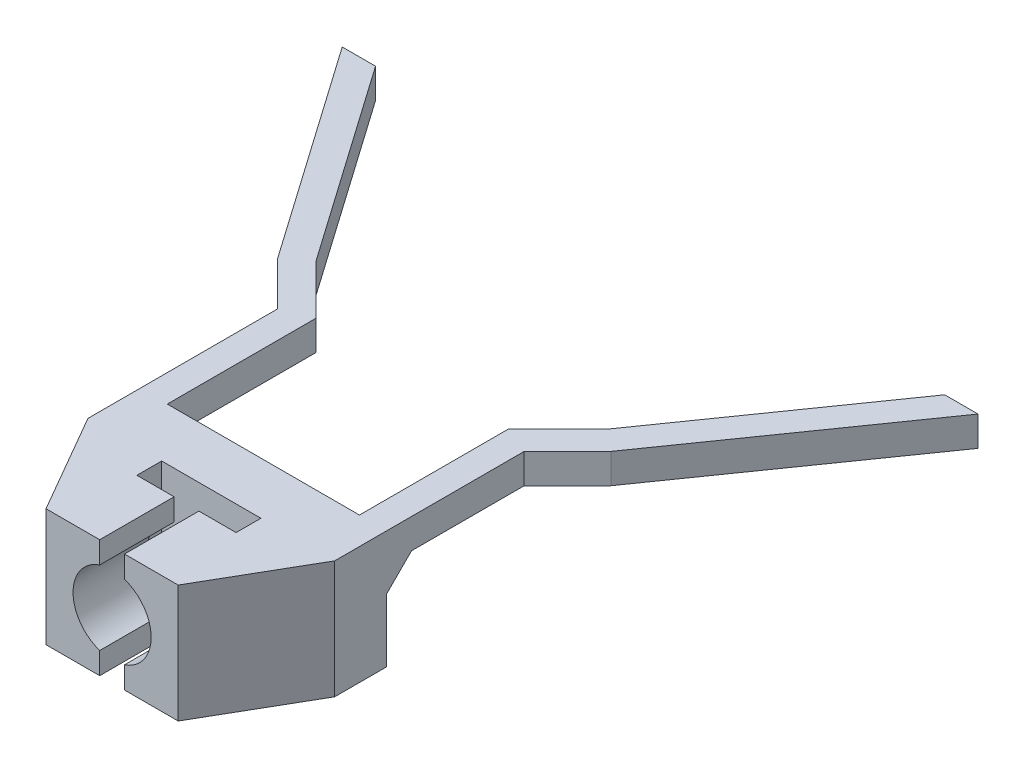
ISO-10303-21;
HEADER;
FILE_DESCRIPTION(('STEP AP214'),'2;1');
FILE_NAME('part.step','',(''),(''),'','','');
FILE_SCHEMA(('AUTOMOTIVE_DESIGN { 1 0 10303 214 1 1 1 1 }'));
ENDSEC;
DATA;
#1=APPLICATION_CONTEXT('core data for automotive mechanical design processes');
#2=APPLICATION_PROTOCOL_DEFINITION('international standard','automotive_design',2000,#1);
#3=PRODUCT_CONTEXT('',#1,'mechanical');
#4=PRODUCT('Part','Part','',(#3));
#5=PRODUCT_RELATED_PRODUCT_CATEGORY('part','',(#4));
#6=PRODUCT_DEFINITION_FORMATION('','',#4);
#7=PRODUCT_DEFINITION_CONTEXT('part definition',#1,'design');
#8=PRODUCT_DEFINITION('design','',#6,#7);
#9=PRODUCT_DEFINITION_SHAPE('','',#8);
#10=(LENGTH_UNIT() NAMED_UNIT(*) SI_UNIT(.MILLI.,.METRE.));
#11=(NAMED_UNIT(*) PLANE_ANGLE_UNIT() SI_UNIT($,.RADIAN.));
#12=(NAMED_UNIT(*) SI_UNIT($,.STERADIAN.) SOLID_ANGLE_UNIT());
#13=UNCERTAINTY_MEASURE_WITH_UNIT(LENGTH_MEASURE(1.E-05),#10,'distance_accuracy_value','');
#14=(GEOMETRIC_REPRESENTATION_CONTEXT(3) GLOBAL_UNCERTAINTY_ASSIGNED_CONTEXT((#13)) GLOBAL_UNIT_ASSIGNED_CONTEXT((#10,
#11,#12)) REPRESENTATION_CONTEXT('',''));
#15=CARTESIAN_POINT('',(0.,0.,0.));
#16=DIRECTION('',(0.,0.,1.));
#17=DIRECTION('',(1.,0.,0.));
#18=AXIS2_PLACEMENT_3D('',#15,#16,#17);
#19=CARTESIAN_POINT('',(0.,0.,12.2));
#20=DIRECTION('',(0.,0.,1.));
#21=DIRECTION('',(1.,0.,0.));
#22=AXIS2_PLACEMENT_3D('',#19,#20,#21);
#23=PLANE('',#22);
#24=DIRECTION('',(1.,0.,0.));
#25=VECTOR('',#24,1.);
#26=CARTESIAN_POINT('',(-9.95,-8.3,12.2));
#27=LINE('',#26,#25);
#28=CARTESIAN_POINT('',(1.,-8.3,12.2));
#29=VERTEX_POINT('',#28);
#30=CARTESIAN_POINT('',(5.33119784648299,-8.3,12.2));
#31=VERTEX_POINT('',#30);
#32=EDGE_CURVE('E366',#29,#31,#27,.T.);
#33=ORIENTED_EDGE('',*,*,#32,.T.);
#34=DIRECTION('',(0.,1.,0.));
#35=VECTOR('',#34,1.);
#36=CARTESIAN_POINT('',(5.33119784648299,0.,12.2));
#37=LINE('',#36,#35);
#38=CARTESIAN_POINT('',(5.33119784648299,1.2,12.2));
#39=VERTEX_POINT('',#38);
#40=EDGE_CURVE('E507',#31,#39,#37,.T.);
#41=ORIENTED_EDGE('',*,*,#40,.T.);
#42=DIRECTION('',(-1.,0.,0.));
#43=VECTOR('',#42,1.);
#44=CARTESIAN_POINT('',(-9.95,1.2,12.2));
#45=LINE('',#44,#43);
#46=CARTESIAN_POINT('',(1.,1.2,12.2));
#47=VERTEX_POINT('',#46);
#48=EDGE_CURVE('E370',#39,#47,#45,.T.);
#49=ORIENTED_EDGE('',*,*,#48,.T.);
#50=DIRECTION('',(0.,1.,0.));
#51=VECTOR('',#50,1.);
#52=CARTESIAN_POINT('',(1.,1.2,12.2));
#53=LINE('',#52,#51);
#54=CARTESIAN_POINT('',(1.,-0.562944593751231,12.2));
#55=VERTEX_POINT('',#54);
#56=EDGE_CURVE('E336',#55,#47,#53,.T.);
#57=ORIENTED_EDGE('',*,*,#56,.F.);
#58=CARTESIAN_POINT('',(0.,-3.55,12.2));
#59=DIRECTION('',(0.,0.,1.));
#60=DIRECTION('',(1.,0.,0.));
#61=AXIS2_PLACEMENT_3D('',#58,#59,#60);
#62=CIRCLE('',#61,3.15);
#63=CARTESIAN_POINT('',(0.999999999999999,-6.53705540624877,12.2));
#64=VERTEX_POINT('',#63);
#65=EDGE_CURVE('E333',#64,#55,#62,.T.);
#66=ORIENTED_EDGE('',*,*,#65,.F.);
#67=DIRECTION('',(0.,1.,0.));
#68=VECTOR('',#67,1.);
#69=CARTESIAN_POINT('',(1.,-6.53705540624877,12.2));
#70=LINE('',#69,#68);
#71=EDGE_CURVE('E330',#29,#64,#70,.T.);
#72=ORIENTED_EDGE('',*,*,#71,.F.);
#73=EDGE_LOOP('',(#33,#41,#49,#57,#66,#72));
#74=FACE_BOUND('',#73,.T.);
#75=ADVANCED_FACE('F39',(#74),#23,.T.);
#76=CARTESIAN_POINT('',(0.,-1.2,0.));
#77=DIRECTION('',(0.,1.,0.));
#78=DIRECTION('',(0.,0.,1.));
#79=AXIS2_PLACEMENT_3D('',#76,#77,#78);
#80=PLANE('',#79);
#81=DIRECTION('',(0.,0.,-1.));
#82=VECTOR('',#81,1.);
#83=CARTESIAN_POINT('',(-7.75,-1.2,0.));
#84=LINE('',#83,#82);
#85=CARTESIAN_POINT('',(-7.75,-1.2,-1.99999999999999));
#86=VERTEX_POINT('',#85);
#87=CARTESIAN_POINT('',(-7.75,-1.2,-12.));
#88=VERTEX_POINT('',#87);
#89=EDGE_CURVE('E432',#86,#88,#84,.T.);
#90=ORIENTED_EDGE('',*,*,#89,.F.);
#91=DIRECTION('',(-1.,0.,0.));
#92=VECTOR('',#91,1.);
#93=CARTESIAN_POINT('',(-9.95,-1.2,-1.99999999999999));
#94=LINE('',#93,#92);
#95=CARTESIAN_POINT('',(-9.95,-1.2,-2.));
#96=VERTEX_POINT('',#95);
#97=EDGE_CURVE('E496',#86,#96,#94,.T.);
#98=ORIENTED_EDGE('',*,*,#97,.T.);
#99=DIRECTION('',(0.,0.,1.));
#100=VECTOR('',#99,1.);
#101=CARTESIAN_POINT('',(-9.95,-1.2,2.2));
#102=LINE('',#101,#100);
#103=CARTESIAN_POINT('',(-9.95,-1.2,-11.0887301627792));
#104=VERTEX_POINT('',#103);
#105=EDGE_CURVE('E437',#104,#96,#102,.T.);
#106=ORIENTED_EDGE('',*,*,#105,.F.);
#107=DIRECTION('',(0.707106781186547,0.,0.707106781186547));
#108=VECTOR('',#107,1.);
#109=CARTESIAN_POINT('',(-9.95,-1.2,-11.0887301627792));
#110=LINE('',#109,#108);
#111=CARTESIAN_POINT('',(-13.4417353385739,-1.2,-14.5804655013531));
#112=VERTEX_POINT('',#111);
#113=EDGE_CURVE('E462',#112,#104,#110,.T.);
#114=ORIENTED_EDGE('',*,*,#113,.F.);
#115=DIRECTION('',(0.573576436351047,0.,0.819152044288991));
#116=VECTOR('',#115,1.);
#117=CARTESIAN_POINT('',(-13.4417353385739,-1.2,-14.5804655013531));
#118=LINE('',#117,#116);
#119=CARTESIAN_POINT('',(-25.6390247066306,-1.2,-32.));
#120=VERTEX_POINT('',#119);
#121=EDGE_CURVE('E460',#120,#112,#118,.T.);
#122=ORIENTED_EDGE('',*,*,#121,.F.);
#123=DIRECTION('',(-1.,0.,0.));
#124=VECTOR('',#123,1.);
#125=CARTESIAN_POINT('',(-22.9533206113554,-1.2,-32.));
#126=LINE('',#125,#124);
#127=CARTESIAN_POINT('',(-22.9533206113554,-1.2,-32.));
#128=VERTEX_POINT('',#127);
#129=EDGE_CURVE('E458',#128,#120,#126,.T.);
#130=ORIENTED_EDGE('',*,*,#129,.F.);
#131=DIRECTION('',(-0.573576436351047,0.,-0.819152044288991));
#132=VECTOR('',#131,1.);
#133=CARTESIAN_POINT('',(-11.75,-1.2,-16.));
#134=LINE('',#133,#132);
#135=CARTESIAN_POINT('',(-11.75,-1.2,-16.));
#136=VERTEX_POINT('',#135);
#137=EDGE_CURVE('E456',#136,#128,#134,.T.);
#138=ORIENTED_EDGE('',*,*,#137,.F.);
#139=DIRECTION('',(-0.707106781186549,0.,-0.707106781186546));
#140=VECTOR('',#139,1.);
#141=CARTESIAN_POINT('',(-7.75,-1.2,-12.));
#142=LINE('',#141,#140);
#143=EDGE_CURVE('E454',#88,#136,#142,.T.);
#144=ORIENTED_EDGE('',*,*,#143,.F.);
#145=EDGE_LOOP('',(#90,#98,#106,#114,#122,#130,#138,#144));
#146=FACE_BOUND('',#145,.T.);
#147=ADVANCED_FACE('F549',(#146),#80,.F.);
#148=DIRECTION('',(0.,0.,1.));
#149=VECTOR('',#148,1.);
#150=CARTESIAN_POINT('',(9.95,-1.2,2.2));
#151=LINE('',#150,#149);
#152=CARTESIAN_POINT('',(9.95,-1.2,-11.0887301627792));
#153=VERTEX_POINT('',#152);
#154=CARTESIAN_POINT('',(9.95,-1.2,-2.));
#155=VERTEX_POINT('',#154);
#156=EDGE_CURVE('E401',#153,#155,#151,.T.);
#157=ORIENTED_EDGE('',*,*,#156,.T.);
#158=DIRECTION('',(-1.,0.,0.));
#159=VECTOR('',#158,1.);
#160=CARTESIAN_POINT('',(7.75,-1.2,-1.99999999999999));
#161=LINE('',#160,#159);
#162=CARTESIAN_POINT('',(7.75,-1.2,-1.99999999999999));
#163=VERTEX_POINT('',#162);
#164=EDGE_CURVE('E494',#155,#163,#161,.T.);
#165=ORIENTED_EDGE('',*,*,#164,.T.);
#166=DIRECTION('',(0.,0.,-1.));
#167=VECTOR('',#166,1.);
#168=CARTESIAN_POINT('',(7.75,-1.2,0.));
#169=LINE('',#168,#167);
#170=CARTESIAN_POINT('',(7.75,-1.2,-12.));
#171=VERTEX_POINT('',#170);
#172=EDGE_CURVE('E376',#163,#171,#169,.T.);
#173=ORIENTED_EDGE('',*,*,#172,.T.);
#174=DIRECTION('',(0.707106781186549,0.,-0.707106781186546));
#175=VECTOR('',#174,1.);
#176=CARTESIAN_POINT('',(7.75,-1.2,-12.));
#177=LINE('',#176,#175);
#178=CARTESIAN_POINT('',(11.75,-1.2,-16.));
#179=VERTEX_POINT('',#178);
#180=EDGE_CURVE('E381',#171,#179,#177,.T.);
#181=ORIENTED_EDGE('',*,*,#180,.T.);
#182=DIRECTION('',(0.573576436351047,0.,-0.819152044288991));
#183=VECTOR('',#182,1.);
#184=CARTESIAN_POINT('',(11.75,-1.2,-16.));
#185=LINE('',#184,#183);
#186=CARTESIAN_POINT('',(22.9533206113554,-1.2,-32.));
#187=VERTEX_POINT('',#186);
#188=EDGE_CURVE('E413',#179,#187,#185,.T.);
#189=ORIENTED_EDGE('',*,*,#188,.T.);
#190=DIRECTION('',(1.,0.,0.));
#191=VECTOR('',#190,1.);
#192=CARTESIAN_POINT('',(22.9533206113554,-1.2,-32.));
#193=LINE('',#192,#191);
#194=CARTESIAN_POINT('',(25.6390247066306,-1.2,-32.));
#195=VERTEX_POINT('',#194);
#196=EDGE_CURVE('E410',#187,#195,#193,.T.);
#197=ORIENTED_EDGE('',*,*,#196,.T.);
#198=DIRECTION('',(-0.573576436351047,0.,0.819152044288991));
#199=VECTOR('',#198,1.);
#200=CARTESIAN_POINT('',(13.4417353385739,-1.2,-14.5804655013531));
#201=LINE('',#200,#199);
#202=CARTESIAN_POINT('',(13.4417353385739,-1.2,-14.5804655013531));
#203=VERTEX_POINT('',#202);
#204=EDGE_CURVE('E407',#195,#203,#201,.T.);
#205=ORIENTED_EDGE('',*,*,#204,.T.);
#206=DIRECTION('',(-0.707106781186547,0.,0.707106781186547));
#207=VECTOR('',#206,1.);
#208=CARTESIAN_POINT('',(9.95,-1.2,-11.0887301627792));
#209=LINE('',#208,#207);
#210=EDGE_CURVE('E404',#203,#153,#209,.T.);
#211=ORIENTED_EDGE('',*,*,#210,.T.);
#212=EDGE_LOOP('',(#157,#165,#173,#181,#189,#197,#205,#211));
#213=FACE_BOUND('',#212,.T.);
#214=ADVANCED_FACE('F555',(#213),#80,.F.);
#215=CARTESIAN_POINT('',(-7.75,1.2,0.));
#216=DIRECTION('',(-1.,0.,0.));
#217=DIRECTION('',(0.,0.,1.));
#218=AXIS2_PLACEMENT_3D('',#215,#216,#217);
#219=PLANE('',#218);
#220=DIRECTION('',(0.,-1.,0.));
#221=VECTOR('',#220,1.);
#222=CARTESIAN_POINT('',(-7.75,1.2,0.));
#223=LINE('',#222,#221);
#224=CARTESIAN_POINT('',(-7.75,1.2,0.));
#225=VERTEX_POINT('',#224);
#226=CARTESIAN_POINT('',(-7.75,-3.20000000000002,0.));
#227=VERTEX_POINT('',#226);
#228=EDGE_CURVE('E452',#225,#227,#223,.T.);
#229=ORIENTED_EDGE('',*,*,#228,.T.);
#230=DIRECTION('',(0.,-0.707106781186551,0.707106781186544));
#231=VECTOR('',#230,1.);
#232=CARTESIAN_POINT('',(-7.75,-0.999999999999985,-2.20000000000001));
#233=LINE('',#232,#231);
#234=EDGE_CURVE('E503',#227,#86,#233,.F.);
#235=ORIENTED_EDGE('',*,*,#234,.T.);
#236=ORIENTED_EDGE('',*,*,#89,.T.);
#237=DIRECTION('',(0.,-1.,0.));
#238=VECTOR('',#237,1.);
#239=CARTESIAN_POINT('',(-7.75,1.2,-12.));
#240=LINE('',#239,#238);
#241=CARTESIAN_POINT('',(-7.75,1.2,-12.));
#242=VERTEX_POINT('',#241);
#243=EDGE_CURVE('E482',#242,#88,#240,.T.);
#244=ORIENTED_EDGE('',*,*,#243,.F.);
#245=DIRECTION('',(0.,0.,-1.));
#246=VECTOR('',#245,1.);
#247=CARTESIAN_POINT('',(-7.75,1.2,0.));
#248=LINE('',#247,#246);
#249=EDGE_CURVE('E433',#225,#242,#248,.T.);
#250=ORIENTED_EDGE('',*,*,#249,.F.);
#251=EDGE_LOOP('',(#229,#235,#236,#244,#250));
#252=FACE_BOUND('',#251,.T.);
#253=ADVANCED_FACE('F624',(#252),#219,.F.);
#254=CARTESIAN_POINT('',(-7.75,1.2,-12.));
#255=DIRECTION('',(-0.707106781186546,0.,0.707106781186549));
#256=DIRECTION('',(0.707106781186549,0.,0.707106781186546));
#257=AXIS2_PLACEMENT_3D('',#254,#255,#256);
#258=PLANE('',#257);
#259=ORIENTED_EDGE('',*,*,#143,.T.);
#260=DIRECTION('',(0.,-1.,0.));
#261=VECTOR('',#260,1.);
#262=CARTESIAN_POINT('',(-11.75,1.2,-16.));
#263=LINE('',#262,#261);
#264=CARTESIAN_POINT('',(-11.75,1.2,-16.));
#265=VERTEX_POINT('',#264);
#266=EDGE_CURVE('E479',#265,#136,#263,.T.);
#267=ORIENTED_EDGE('',*,*,#266,.F.);
#268=DIRECTION('',(-0.707106781186549,0.,-0.707106781186546));
#269=VECTOR('',#268,1.);
#270=CARTESIAN_POINT('',(-7.75,1.2,-12.));
#271=LINE('',#270,#269);
#272=EDGE_CURVE('E436',#242,#265,#271,.T.);
#273=ORIENTED_EDGE('',*,*,#272,.F.);
#274=ORIENTED_EDGE('',*,*,#243,.T.);
#275=EDGE_LOOP('',(#259,#267,#273,#274));
#276=FACE_BOUND('',#275,.T.);
#277=ADVANCED_FACE('F620',(#276),#258,.F.);
#278=CARTESIAN_POINT('',(-11.75,1.2,-16.));
#279=DIRECTION('',(-0.819152044288991,0.,0.573576436351047));
#280=DIRECTION('',(0.573576436351047,0.,0.819152044288991));
#281=AXIS2_PLACEMENT_3D('',#278,#279,#280);
#282=PLANE('',#281);
#283=ORIENTED_EDGE('',*,*,#137,.T.);
#284=DIRECTION('',(0.,-1.,0.));
#285=VECTOR('',#284,1.);
#286=CARTESIAN_POINT('',(-22.9533206113554,1.2,-32.));
#287=LINE('',#286,#285);
#288=CARTESIAN_POINT('',(-22.9533206113554,1.2,-32.));
#289=VERTEX_POINT('',#288);
#290=EDGE_CURVE('E476',#289,#128,#287,.T.);
#291=ORIENTED_EDGE('',*,*,#290,.F.);
#292=DIRECTION('',(-0.573576436351047,0.,-0.819152044288991));
#293=VECTOR('',#292,1.);
#294=CARTESIAN_POINT('',(-11.75,1.2,-16.));
#295=LINE('',#294,#293);
#296=EDGE_CURVE('E439',#265,#289,#295,.T.);
#297=ORIENTED_EDGE('',*,*,#296,.F.);
#298=ORIENTED_EDGE('',*,*,#266,.T.);
#299=EDGE_LOOP('',(#283,#291,#297,#298));
#300=FACE_BOUND('',#299,.T.);
#301=ADVANCED_FACE('F616',(#300),#282,.F.);
#302=CARTESIAN_POINT('',(-22.9533206113554,1.2,-32.));
#303=DIRECTION('',(0.,0.,1.));
#304=DIRECTION('',(1.,0.,0.));
#305=AXIS2_PLACEMENT_3D('',#302,#303,#304);
#306=PLANE('',#305);
#307=ORIENTED_EDGE('',*,*,#129,.T.);
#308=DIRECTION('',(0.,-1.,0.));
#309=VECTOR('',#308,1.);
#310=CARTESIAN_POINT('',(-25.6390247066306,1.2,-32.));
#311=LINE('',#310,#309);
#312=CARTESIAN_POINT('',(-25.6390247066306,1.2,-32.));
#313=VERTEX_POINT('',#312);
#314=EDGE_CURVE('E473',#313,#120,#311,.T.);
#315=ORIENTED_EDGE('',*,*,#314,.F.);
#316=DIRECTION('',(-1.,0.,0.));
#317=VECTOR('',#316,1.);
#318=CARTESIAN_POINT('',(-22.9533206113554,1.2,-32.));
#319=LINE('',#318,#317);
#320=EDGE_CURVE('E441',#289,#313,#319,.T.);
#321=ORIENTED_EDGE('',*,*,#320,.F.);
#322=ORIENTED_EDGE('',*,*,#290,.T.);
#323=EDGE_LOOP('',(#307,#315,#321,#322));
#324=FACE_BOUND('',#323,.T.);
#325=ADVANCED_FACE('F612',(#324),#306,.F.);
#326=CARTESIAN_POINT('',(-13.4417353385739,1.2,-14.5804655013531));
#327=DIRECTION('',(0.819152044288991,0.,-0.573576436351047));
#328=DIRECTION('',(-0.573576436351047,0.,-0.819152044288991));
#329=AXIS2_PLACEMENT_3D('',#326,#327,#328);
#330=PLANE('',#329);
#331=ORIENTED_EDGE('',*,*,#121,.T.);
#332=DIRECTION('',(0.,-1.,0.));
#333=VECTOR('',#332,1.);
#334=CARTESIAN_POINT('',(-13.4417353385739,1.2,-14.5804655013531));
#335=LINE('',#334,#333);
#336=CARTESIAN_POINT('',(-13.4417353385739,1.2,-14.5804655013531));
#337=VERTEX_POINT('',#336);
#338=EDGE_CURVE('E470',#337,#112,#335,.T.);
#339=ORIENTED_EDGE('',*,*,#338,.F.);
#340=DIRECTION('',(0.573576436351047,0.,0.819152044288991));
#341=VECTOR('',#340,1.);
#342=CARTESIAN_POINT('',(-13.4417353385739,1.2,-14.5804655013531));
#343=LINE('',#342,#341);
#344=EDGE_CURVE('E443',#313,#337,#343,.T.);
#345=ORIENTED_EDGE('',*,*,#344,.F.);
#346=ORIENTED_EDGE('',*,*,#314,.T.);
#347=EDGE_LOOP('',(#331,#339,#345,#346));
#348=FACE_BOUND('',#347,.T.);
#349=ADVANCED_FACE('F608',(#348),#330,.F.);
#350=CARTESIAN_POINT('',(-9.95,1.2,-11.0887301627792));
#351=DIRECTION('',(0.707106781186547,0.,-0.707106781186547));
#352=DIRECTION('',(-0.707106781186548,0.,-0.707106781186548));
#353=AXIS2_PLACEMENT_3D('',#350,#351,#352);
#354=PLANE('',#353);
#355=ORIENTED_EDGE('',*,*,#113,.T.);
#356=DIRECTION('',(0.,-1.,0.));
#357=VECTOR('',#356,1.);
#358=CARTESIAN_POINT('',(-9.95,1.2,-11.0887301627792));
#359=LINE('',#358,#357);
#360=CARTESIAN_POINT('',(-9.95,1.2,-11.0887301627792));
#361=VERTEX_POINT('',#360);
#362=EDGE_CURVE('E467',#361,#104,#359,.T.);
#363=ORIENTED_EDGE('',*,*,#362,.F.);
#364=DIRECTION('',(0.707106781186547,0.,0.707106781186547));
#365=VECTOR('',#364,1.);
#366=CARTESIAN_POINT('',(-9.95,1.2,-11.0887301627792));
#367=LINE('',#366,#365);
#368=EDGE_CURVE('E445',#337,#361,#367,.T.);
#369=ORIENTED_EDGE('',*,*,#368,.F.);
#370=ORIENTED_EDGE('',*,*,#338,.T.);
#371=EDGE_LOOP('',(#355,#363,#369,#370));
#372=FACE_BOUND('',#371,.T.);
#373=ADVANCED_FACE('F604',(#372),#354,.F.);
#374=CARTESIAN_POINT('',(-9.95,1.2,2.2));
#375=DIRECTION('',(1.,0.,0.));
#376=DIRECTION('',(0.,0.,-1.));
#377=AXIS2_PLACEMENT_3D('',#374,#375,#376);
#378=PLANE('',#377);
#379=DIRECTION('',(0.,0.,-1.));
#380=VECTOR('',#379,1.);
#381=CARTESIAN_POINT('',(-9.95,-8.3,12.2));
#382=LINE('',#381,#380);
#383=CARTESIAN_POINT('',(-9.95,-8.3,4.19999999999996));
#384=VERTEX_POINT('',#383);
#385=CARTESIAN_POINT('',(-9.95,-8.3,0.));
#386=VERTEX_POINT('',#385);
#387=EDGE_CURVE('E374',#384,#386,#382,.T.);
#388=ORIENTED_EDGE('',*,*,#387,.F.);
#389=DIRECTION('',(0.,1.,0.));
#390=VECTOR('',#389,1.);
#391=CARTESIAN_POINT('',(-9.95,1.2,4.19999999999996));
#392=LINE('',#391,#390);
#393=CARTESIAN_POINT('',(-9.95,1.2,4.19999999999996));
#394=VERTEX_POINT('',#393);
#395=EDGE_CURVE('E11',#384,#394,#392,.T.);
#396=ORIENTED_EDGE('',*,*,#395,.T.);
#397=DIRECTION('',(0.,0.,1.));
#398=VECTOR('',#397,1.);
#399=CARTESIAN_POINT('',(-9.95,1.2,2.2));
#400=LINE('',#399,#398);
#401=EDGE_CURVE('E447',#361,#394,#400,.T.);
#402=ORIENTED_EDGE('',*,*,#401,.F.);
#403=ORIENTED_EDGE('',*,*,#362,.T.);
#404=ORIENTED_EDGE('',*,*,#105,.T.);
#405=DIRECTION('',(0.,0.707106781186551,-0.707106781186544));
#406=VECTOR('',#405,1.);
#407=CARTESIAN_POINT('',(-9.95,-2.09999999999999,-1.10000000000002));
#408=LINE('',#407,#406);
#409=CARTESIAN_POINT('',(-9.95,-3.20000000000002,0.));
#410=VERTEX_POINT('',#409);
#411=EDGE_CURVE('E505',#96,#410,#408,.F.);
#412=ORIENTED_EDGE('',*,*,#411,.T.);
#413=DIRECTION('',(0.,1.,0.));
#414=VECTOR('',#413,1.);
#415=CARTESIAN_POINT('',(-9.95,1.2,0.));
#416=LINE('',#415,#414);
#417=EDGE_CURVE('E360',#386,#410,#416,.T.);
#418=ORIENTED_EDGE('',*,*,#417,.F.);
#419=EDGE_LOOP('',(#388,#396,#402,#403,#404,#412,#418));
#420=FACE_BOUND('',#419,.T.);
#421=ADVANCED_FACE('F600',(#420),#378,.F.);
#422=CARTESIAN_POINT('',(-7.75,1.2,0.));
#423=DIRECTION('',(0.,0.,1.));
#424=DIRECTION('',(1.,0.,0.));
#425=AXIS2_PLACEMENT_3D('',#422,#423,#424);
#426=PLANE('',#425);
#427=DIRECTION('',(0.,-1.,0.));
#428=VECTOR('',#427,1.);
#429=CARTESIAN_POINT('',(7.75,1.2,0.));
#430=LINE('',#429,#428);
#431=CARTESIAN_POINT('',(7.75,1.2,0.));
#432=VERTEX_POINT('',#431);
#433=CARTESIAN_POINT('',(7.75,-3.20000000000002,0.));
#434=VERTEX_POINT('',#433);
#435=EDGE_CURVE('E430',#432,#434,#430,.T.);
#436=ORIENTED_EDGE('',*,*,#435,.T.);
#437=DIRECTION('',(1.,0.,0.));
#438=VECTOR('',#437,1.);
#439=CARTESIAN_POINT('',(9.95,-3.20000000000002,0.));
#440=LINE('',#439,#438);
#441=CARTESIAN_POINT('',(9.95,-3.20000000000002,0.));
#442=VERTEX_POINT('',#441);
#443=EDGE_CURVE('E491',#434,#442,#440,.T.);
#444=ORIENTED_EDGE('',*,*,#443,.T.);
#445=DIRECTION('',(0.,-1.,0.));
#446=VECTOR('',#445,1.);
#447=CARTESIAN_POINT('',(9.95,1.2,0.));
#448=LINE('',#447,#446);
#449=CARTESIAN_POINT('',(9.95,-8.3,0.));
#450=VERTEX_POINT('',#449);
#451=EDGE_CURVE('E343',#442,#450,#448,.T.);
#452=ORIENTED_EDGE('',*,*,#451,.T.);
#453=DIRECTION('',(-1.,0.,0.));
#454=VECTOR('',#453,1.);
#455=CARTESIAN_POINT('',(-9.95,-8.3,0.));
#456=LINE('',#455,#454);
#457=EDGE_CURVE('E363',#450,#386,#456,.T.);
#458=ORIENTED_EDGE('',*,*,#457,.T.);
#459=ORIENTED_EDGE('',*,*,#417,.T.);
#460=DIRECTION('',(1.,0.,0.));
#461=VECTOR('',#460,1.);
#462=CARTESIAN_POINT('',(-7.75,-3.20000000000002,0.));
#463=LINE('',#462,#461);
#464=EDGE_CURVE('E488',#410,#227,#463,.T.);
#465=ORIENTED_EDGE('',*,*,#464,.T.);
#466=ORIENTED_EDGE('',*,*,#228,.F.);
#467=DIRECTION('',(-1.,0.,0.));
#468=VECTOR('',#467,1.);
#469=CARTESIAN_POINT('',(-7.75,1.2,0.));
#470=LINE('',#469,#468);
#471=EDGE_CURVE('E450',#432,#225,#470,.T.);
#472=ORIENTED_EDGE('',*,*,#471,.F.);
#473=EDGE_LOOP('',(#436,#444,#452,#458,#459,#465,#466,#472));
#474=FACE_BOUND('',#473,.T.);
#475=ADVANCED_FACE('F596',(#474),#426,.F.);
#476=CARTESIAN_POINT('',(0.,1.2,0.));
#477=DIRECTION('',(0.,1.,0.));
#478=DIRECTION('',(0.,0.,1.));
#479=AXIS2_PLACEMENT_3D('',#476,#477,#478);
#480=PLANE('',#479);
#481=ORIENTED_EDGE('',*,*,#48,.F.);
#482=DIRECTION('',(-0.499999999999998,0.,0.86602540378444));
#483=VECTOR('',#482,1.);
#484=CARTESIAN_POINT('',(9.28115334794732,1.2,5.35847638382756));
#485=LINE('',#484,#483);
#486=CARTESIAN_POINT('',(9.95,1.2,4.19999999999996));
#487=VERTEX_POINT('',#486);
#488=EDGE_CURVE('E512',#39,#487,#485,.F.);
#489=ORIENTED_EDGE('',*,*,#488,.T.);
#490=DIRECTION('',(0.,0.,1.));
#491=VECTOR('',#490,1.);
#492=CARTESIAN_POINT('',(9.95,1.2,2.2));
#493=LINE('',#492,#491);
#494=CARTESIAN_POINT('',(9.95,1.2,-11.0887301627792));
#495=VERTEX_POINT('',#494);
#496=EDGE_CURVE('E380',#495,#487,#493,.T.);
#497=ORIENTED_EDGE('',*,*,#496,.F.);
#498=DIRECTION('',(-0.707106781186547,0.,0.707106781186547));
#499=VECTOR('',#498,1.);
#500=CARTESIAN_POINT('',(9.95,1.2,-11.0887301627792));
#501=LINE('',#500,#499);
#502=CARTESIAN_POINT('',(13.4417353385739,1.2,-14.5804655013531));
#503=VERTEX_POINT('',#502);
#504=EDGE_CURVE('E384',#503,#495,#501,.T.);
#505=ORIENTED_EDGE('',*,*,#504,.F.);
#506=DIRECTION('',(-0.573576436351047,0.,0.819152044288991));
#507=VECTOR('',#506,1.);
#508=CARTESIAN_POINT('',(13.4417353385739,1.2,-14.5804655013531));
#509=LINE('',#508,#507);
#510=CARTESIAN_POINT('',(25.6390247066306,1.2,-32.));
#511=VERTEX_POINT('',#510);
#512=EDGE_CURVE('E387',#511,#503,#509,.T.);
#513=ORIENTED_EDGE('',*,*,#512,.F.);
#514=DIRECTION('',(1.,0.,0.));
#515=VECTOR('',#514,1.);
#516=CARTESIAN_POINT('',(22.9533206113554,1.2,-32.));
#517=LINE('',#516,#515);
#518=CARTESIAN_POINT('',(22.9533206113554,1.2,-32.));
#519=VERTEX_POINT('',#518);
#520=EDGE_CURVE('E390',#519,#511,#517,.T.);
#521=ORIENTED_EDGE('',*,*,#520,.F.);
#522=DIRECTION('',(0.573576436351047,0.,-0.819152044288991));
#523=VECTOR('',#522,1.);
#524=CARTESIAN_POINT('',(11.75,1.2,-16.));
#525=LINE('',#524,#523);
#526=CARTESIAN_POINT('',(11.75,1.2,-16.));
#527=VERTEX_POINT('',#526);
#528=EDGE_CURVE('E393',#527,#519,#525,.T.);
#529=ORIENTED_EDGE('',*,*,#528,.F.);
#530=DIRECTION('',(0.707106781186549,0.,-0.707106781186546));
#531=VECTOR('',#530,1.);
#532=CARTESIAN_POINT('',(7.75,1.2,-12.));
#533=LINE('',#532,#531);
#534=CARTESIAN_POINT('',(7.75,1.2,-12.));
#535=VERTEX_POINT('',#534);
#536=EDGE_CURVE('E396',#535,#527,#533,.T.);
#537=ORIENTED_EDGE('',*,*,#536,.F.);
#538=DIRECTION('',(0.,0.,-1.));
#539=VECTOR('',#538,1.);
#540=CARTESIAN_POINT('',(7.75,1.2,0.));
#541=LINE('',#540,#539);
#542=EDGE_CURVE('E377',#432,#535,#541,.T.);
#543=ORIENTED_EDGE('',*,*,#542,.F.);
#544=ORIENTED_EDGE('',*,*,#471,.T.);
#545=ORIENTED_EDGE('',*,*,#249,.T.);
#546=ORIENTED_EDGE('',*,*,#272,.T.);
#547=ORIENTED_EDGE('',*,*,#296,.T.);
#548=ORIENTED_EDGE('',*,*,#320,.T.);
#549=ORIENTED_EDGE('',*,*,#344,.T.);
#550=ORIENTED_EDGE('',*,*,#368,.T.);
#551=ORIENTED_EDGE('',*,*,#401,.T.);
#552=DIRECTION('',(0.499999999999998,0.,0.86602540378444));
#553=VECTOR('',#552,1.);
#554=CARTESIAN_POINT('',(-9.28115334794732,1.2,5.35847638382756));
#555=LINE('',#554,#553);
#556=CARTESIAN_POINT('',(-5.33119784648299,1.2,12.2));
#557=VERTEX_POINT('',#556);
#558=EDGE_CURVE('E510',#394,#557,#555,.T.);
#559=ORIENTED_EDGE('',*,*,#558,.T.);
#560=CARTESIAN_POINT('',(-1.,1.2,12.2));
#561=VERTEX_POINT('',#560);
#562=EDGE_CURVE('E369',#561,#557,#45,.T.);
#563=ORIENTED_EDGE('',*,*,#562,.F.);
#564=DIRECTION('',(0.,0.,1.));
#565=VECTOR('',#564,1.);
#566=CARTESIAN_POINT('',(-1.,1.2,4.2));
#567=LINE('',#566,#565);
#568=CARTESIAN_POINT('',(-1.,1.2,6.2));
#569=VERTEX_POINT('',#568);
#570=EDGE_CURVE('E286',#569,#561,#567,.T.);
#571=ORIENTED_EDGE('',*,*,#570,.F.);
#572=DIRECTION('',(1.,0.,0.));
#573=VECTOR('',#572,1.);
#574=CARTESIAN_POINT('',(-4.,1.2,6.2));
#575=LINE('',#574,#573);
#576=CARTESIAN_POINT('',(-4.,1.2,6.2));
#577=VERTEX_POINT('',#576);
#578=EDGE_CURVE('E263',#577,#569,#575,.T.);
#579=ORIENTED_EDGE('',*,*,#578,.F.);
#580=DIRECTION('',(0.,0.,1.));
#581=VECTOR('',#580,1.);
#582=CARTESIAN_POINT('',(-4.,1.2,4.2));
#583=LINE('',#582,#581);
#584=CARTESIAN_POINT('',(-4.,1.2,4.2));
#585=VERTEX_POINT('',#584);
#586=EDGE_CURVE('E275',#585,#577,#583,.T.);
#587=ORIENTED_EDGE('',*,*,#586,.F.);
#588=DIRECTION('',(-1.,0.,0.));
#589=VECTOR('',#588,1.);
#590=CARTESIAN_POINT('',(-1.,1.2,4.2));
#591=LINE('',#590,#589);
#592=CARTESIAN_POINT('',(4.,1.2,4.2));
#593=VERTEX_POINT('',#592);
#594=EDGE_CURVE('E321',#593,#585,#591,.T.);
#595=ORIENTED_EDGE('',*,*,#594,.F.);
#596=DIRECTION('',(0.,0.,-1.));
#597=VECTOR('',#596,1.);
#598=CARTESIAN_POINT('',(4.,1.2,4.2));
#599=LINE('',#598,#597);
#600=CARTESIAN_POINT('',(4.,1.2,6.2));
#601=VERTEX_POINT('',#600);
#602=EDGE_CURVE('E287',#601,#593,#599,.T.);
#603=ORIENTED_EDGE('',*,*,#602,.F.);
#604=CARTESIAN_POINT('',(1.,1.2,6.2));
#605=VERTEX_POINT('',#604);
#606=EDGE_CURVE('E280',#605,#601,#575,.T.);
#607=ORIENTED_EDGE('',*,*,#606,.F.);
#608=DIRECTION('',(0.,0.,1.));
#609=VECTOR('',#608,1.);
#610=CARTESIAN_POINT('',(1.,1.2,4.2));
#611=LINE('',#610,#609);
#612=EDGE_CURVE('E345',#605,#47,#611,.T.);
#613=ORIENTED_EDGE('',*,*,#612,.T.);
#614=EDGE_LOOP('',(#481,#489,#497,#505,#513,#521,#529,#537,#543,#544,#545,#546,#547,#548,#549,
#550,#551,#559,#563,#571,#579,#587,#595,#603,#607,#613));
#615=FACE_BOUND('',#614,.T.);
#616=ADVANCED_FACE('F284',(#615),#480,.T.);
#617=CARTESIAN_POINT('',(7.75,1.2,0.));
#618=DIRECTION('',(-1.,0.,0.));
#619=DIRECTION('',(0.,0.,1.));
#620=AXIS2_PLACEMENT_3D('',#617,#618,#619);
#621=PLANE('',#620);
#622=ORIENTED_EDGE('',*,*,#172,.F.);
#623=DIRECTION('',(0.,0.707106781186551,-0.707106781186544));
#624=VECTOR('',#623,1.);
#625=CARTESIAN_POINT('',(7.75,-3.20000000000002,0.));
#626=LINE('',#625,#624);
#627=EDGE_CURVE('E500',#163,#434,#626,.F.);
#628=ORIENTED_EDGE('',*,*,#627,.T.);
#629=ORIENTED_EDGE('',*,*,#435,.F.);
#630=ORIENTED_EDGE('',*,*,#542,.T.);
#631=DIRECTION('',(0.,-1.,0.));
#632=VECTOR('',#631,1.);
#633=CARTESIAN_POINT('',(7.75,1.2,-12.));
#634=LINE('',#633,#632);
#635=EDGE_CURVE('E399',#535,#171,#634,.T.);
#636=ORIENTED_EDGE('',*,*,#635,.T.);
#637=EDGE_LOOP('',(#622,#628,#629,#630,#636));
#638=FACE_BOUND('',#637,.T.);
#639=ADVANCED_FACE('F590',(#638),#621,.T.);
#640=CARTESIAN_POINT('',(9.95,1.2,2.2));
#641=DIRECTION('',(1.,0.,0.));
#642=DIRECTION('',(0.,0.,-1.));
#643=AXIS2_PLACEMENT_3D('',#640,#641,#642);
#644=PLANE('',#643);
#645=ORIENTED_EDGE('',*,*,#496,.T.);
#646=DIRECTION('',(0.,-1.,0.));
#647=VECTOR('',#646,1.);
#648=CARTESIAN_POINT('',(9.95,1.2,4.19999999999996));
#649=LINE('',#648,#647);
#650=CARTESIAN_POINT('',(9.95,-8.3,4.19999999999996));
#651=VERTEX_POINT('',#650);
#652=EDGE_CURVE('E514',#487,#651,#649,.T.);
#653=ORIENTED_EDGE('',*,*,#652,.T.);
#654=DIRECTION('',(0.,0.,-1.));
#655=VECTOR('',#654,1.);
#656=CARTESIAN_POINT('',(9.95,-8.3,12.2));
#657=LINE('',#656,#655);
#658=EDGE_CURVE('E372',#651,#450,#657,.T.);
#659=ORIENTED_EDGE('',*,*,#658,.T.);
#660=ORIENTED_EDGE('',*,*,#451,.F.);
#661=DIRECTION('',(0.,-0.707106781186551,0.707106781186544));
#662=VECTOR('',#661,1.);
#663=CARTESIAN_POINT('',(9.95,-3.20000000000002,0.));
#664=LINE('',#663,#662);
#665=EDGE_CURVE('E498',#442,#155,#664,.F.);
#666=ORIENTED_EDGE('',*,*,#665,.T.);
#667=ORIENTED_EDGE('',*,*,#156,.F.);
#668=DIRECTION('',(0.,-1.,0.));
#669=VECTOR('',#668,1.);
#670=CARTESIAN_POINT('',(9.95,1.2,-11.0887301627792));
#671=LINE('',#670,#669);
#672=EDGE_CURVE('E428',#495,#153,#671,.T.);
#673=ORIENTED_EDGE('',*,*,#672,.F.);
#674=EDGE_LOOP('',(#645,#653,#659,#660,#666,#667,#673));
#675=FACE_BOUND('',#674,.T.);
#676=ADVANCED_FACE('F586',(#675),#644,.T.);
#677=CARTESIAN_POINT('',(9.95,1.2,-11.0887301627792));
#678=DIRECTION('',(0.707106781186547,0.,0.707106781186547));
#679=DIRECTION('',(0.707106781186548,0.,-0.707106781186548));
#680=AXIS2_PLACEMENT_3D('',#677,#678,#679);
#681=PLANE('',#680);
#682=ORIENTED_EDGE('',*,*,#210,.F.);
#683=DIRECTION('',(0.,-1.,0.));
#684=VECTOR('',#683,1.);
#685=CARTESIAN_POINT('',(13.4417353385739,1.2,-14.5804655013531));
#686=LINE('',#685,#684);
#687=EDGE_CURVE('E426',#503,#203,#686,.T.);
#688=ORIENTED_EDGE('',*,*,#687,.F.);
#689=ORIENTED_EDGE('',*,*,#504,.T.);
#690=ORIENTED_EDGE('',*,*,#672,.T.);
#691=EDGE_LOOP('',(#682,#688,#689,#690));
#692=FACE_BOUND('',#691,.T.);
#693=ADVANCED_FACE('F582',(#692),#681,.T.);
#694=CARTESIAN_POINT('',(13.4417353385739,1.2,-14.5804655013531));
#695=DIRECTION('',(0.819152044288991,0.,0.573576436351047));
#696=DIRECTION('',(0.573576436351047,0.,-0.819152044288991));
#697=AXIS2_PLACEMENT_3D('',#694,#695,#696);
#698=PLANE('',#697);
#699=ORIENTED_EDGE('',*,*,#204,.F.);
#700=DIRECTION('',(0.,-1.,0.));
#701=VECTOR('',#700,1.);
#702=CARTESIAN_POINT('',(25.6390247066306,1.2,-32.));
#703=LINE('',#702,#701);
#704=EDGE_CURVE('E424',#511,#195,#703,.T.);
#705=ORIENTED_EDGE('',*,*,#704,.F.);
#706=ORIENTED_EDGE('',*,*,#512,.T.);
#707=ORIENTED_EDGE('',*,*,#687,.T.);
#708=EDGE_LOOP('',(#699,#705,#706,#707));
#709=FACE_BOUND('',#708,.T.);
#710=ADVANCED_FACE('F578',(#709),#698,.T.);
#711=CARTESIAN_POINT('',(22.9533206113554,1.2,-32.));
#712=DIRECTION('',(0.,0.,-1.));
#713=DIRECTION('',(-1.,0.,0.));
#714=AXIS2_PLACEMENT_3D('',#711,#712,#713);
#715=PLANE('',#714);
#716=ORIENTED_EDGE('',*,*,#196,.F.);
#717=DIRECTION('',(0.,-1.,0.));
#718=VECTOR('',#717,1.);
#719=CARTESIAN_POINT('',(22.9533206113554,1.2,-32.));
#720=LINE('',#719,#718);
#721=EDGE_CURVE('E422',#519,#187,#720,.T.);
#722=ORIENTED_EDGE('',*,*,#721,.F.);
#723=ORIENTED_EDGE('',*,*,#520,.T.);
#724=ORIENTED_EDGE('',*,*,#704,.T.);
#725=EDGE_LOOP('',(#716,#722,#723,#724));
#726=FACE_BOUND('',#725,.T.);
#727=ADVANCED_FACE('F574',(#726),#715,.T.);
#728=CARTESIAN_POINT('',(11.75,1.2,-16.));
#729=DIRECTION('',(-0.819152044288991,0.,-0.573576436351047));
#730=DIRECTION('',(-0.573576436351047,0.,0.819152044288991));
#731=AXIS2_PLACEMENT_3D('',#728,#729,#730);
#732=PLANE('',#731);
#733=ORIENTED_EDGE('',*,*,#188,.F.);
#734=DIRECTION('',(0.,-1.,0.));
#735=VECTOR('',#734,1.);
#736=CARTESIAN_POINT('',(11.75,1.2,-16.));
#737=LINE('',#736,#735);
#738=EDGE_CURVE('E420',#527,#179,#737,.T.);
#739=ORIENTED_EDGE('',*,*,#738,.F.);
#740=ORIENTED_EDGE('',*,*,#528,.T.);
#741=ORIENTED_EDGE('',*,*,#721,.T.);
#742=EDGE_LOOP('',(#733,#739,#740,#741));
#743=FACE_BOUND('',#742,.T.);
#744=ADVANCED_FACE('F568',(#743),#732,.T.);
#745=CARTESIAN_POINT('',(7.75,1.2,-12.));
#746=DIRECTION('',(-0.707106781186546,0.,-0.707106781186549));
#747=DIRECTION('',(-0.707106781186549,0.,0.707106781186546));
#748=AXIS2_PLACEMENT_3D('',#745,#746,#747);
#749=PLANE('',#748);
#750=ORIENTED_EDGE('',*,*,#180,.F.);
#751=ORIENTED_EDGE('',*,*,#635,.F.);
#752=ORIENTED_EDGE('',*,*,#536,.T.);
#753=ORIENTED_EDGE('',*,*,#738,.T.);
#754=EDGE_LOOP('',(#750,#751,#752,#753));
#755=FACE_BOUND('',#754,.T.);
#756=ADVANCED_FACE('F564',(#755),#749,.T.);
#757=CARTESIAN_POINT('',(-9.95,-8.3,12.2));
#758=DIRECTION('',(0.,1.,0.));
#759=DIRECTION('',(0.,0.,1.));
#760=AXIS2_PLACEMENT_3D('',#757,#758,#759);
#761=PLANE('',#760);
#762=ORIENTED_EDGE('',*,*,#658,.F.);
#763=DIRECTION('',(0.499999999999998,0.,-0.86602540378444));
#764=VECTOR('',#763,1.);
#765=CARTESIAN_POINT('',(5.33119784648299,-8.3,12.2));
#766=LINE('',#765,#764);
#767=EDGE_CURVE('E517',#651,#31,#766,.F.);
#768=ORIENTED_EDGE('',*,*,#767,.T.);
#769=ORIENTED_EDGE('',*,*,#32,.F.);
#770=DIRECTION('',(0.,0.,1.));
#771=VECTOR('',#770,1.);
#772=CARTESIAN_POINT('',(1.,-8.3,4.2));
#773=LINE('',#772,#771);
#774=CARTESIAN_POINT('',(1.,-8.3,6.2));
#775=VERTEX_POINT('',#774);
#776=EDGE_CURVE('E352',#775,#29,#773,.T.);
#777=ORIENTED_EDGE('',*,*,#776,.F.);
#778=DIRECTION('',(1.,0.,0.));
#779=VECTOR('',#778,1.);
#780=CARTESIAN_POINT('',(-4.,-8.3,6.2));
#781=LINE('',#780,#779);
#782=CARTESIAN_POINT('',(4.,-8.3,6.2));
#783=VERTEX_POINT('',#782);
#784=EDGE_CURVE('E294',#775,#783,#781,.T.);
#785=ORIENTED_EDGE('',*,*,#784,.T.);
#786=DIRECTION('',(0.,0.,-1.));
#787=VECTOR('',#786,1.);
#788=CARTESIAN_POINT('',(4.,-8.3,4.2));
#789=LINE('',#788,#787);
#790=CARTESIAN_POINT('',(4.,-8.3,4.2));
#791=VERTEX_POINT('',#790);
#792=EDGE_CURVE('E271',#783,#791,#789,.T.);
#793=ORIENTED_EDGE('',*,*,#792,.T.);
#794=DIRECTION('',(1.,0.,0.));
#795=VECTOR('',#794,1.);
#796=CARTESIAN_POINT('',(1.,-8.3,4.2));
#797=LINE('',#796,#795);
#798=CARTESIAN_POINT('',(-4.,-8.3,4.2));
#799=VERTEX_POINT('',#798);
#800=EDGE_CURVE('E319',#799,#791,#797,.T.);
#801=ORIENTED_EDGE('',*,*,#800,.F.);
#802=DIRECTION('',(0.,0.,1.));
#803=VECTOR('',#802,1.);
#804=CARTESIAN_POINT('',(-4.,-8.3,4.2));
#805=LINE('',#804,#803);
#806=CARTESIAN_POINT('',(-4.,-8.3,6.2));
#807=VERTEX_POINT('',#806);
#808=EDGE_CURVE('E290',#799,#807,#805,.T.);
#809=ORIENTED_EDGE('',*,*,#808,.T.);
#810=CARTESIAN_POINT('',(-1.,-8.3,6.2));
#811=VERTEX_POINT('',#810);
#812=EDGE_CURVE('E266',#807,#811,#781,.T.);
#813=ORIENTED_EDGE('',*,*,#812,.T.);
#814=DIRECTION('',(0.,0.,1.));
#815=VECTOR('',#814,1.);
#816=CARTESIAN_POINT('',(-1.,-8.3,4.2));
#817=LINE('',#816,#815);
#818=CARTESIAN_POINT('',(-1.,-8.3,12.2));
#819=VERTEX_POINT('',#818);
#820=EDGE_CURVE('E354',#811,#819,#817,.T.);
#821=ORIENTED_EDGE('',*,*,#820,.T.);
#822=CARTESIAN_POINT('',(-5.33119784648299,-8.3,12.2));
#823=VERTEX_POINT('',#822);
#824=EDGE_CURVE('E367',#823,#819,#27,.T.);
#825=ORIENTED_EDGE('',*,*,#824,.F.);
#826=DIRECTION('',(-0.499999999999998,0.,-0.86602540378444));
#827=VECTOR('',#826,1.);
#828=CARTESIAN_POINT('',(-5.33119784648299,-8.3,12.2));
#829=LINE('',#828,#827);
#830=EDGE_CURVE('E55',#823,#384,#829,.T.);
#831=ORIENTED_EDGE('',*,*,#830,.T.);
#832=ORIENTED_EDGE('',*,*,#387,.T.);
#833=ORIENTED_EDGE('',*,*,#457,.F.);
#834=EDGE_LOOP('',(#762,#768,#769,#777,#785,#793,#801,#809,#813,#821,#825,#831,#832,#833));
#835=FACE_BOUND('',#834,.T.);
#836=ADVANCED_FACE('F525',(#835),#761,.F.);
#837=ORIENTED_EDGE('',*,*,#562,.T.);
#838=DIRECTION('',(0.,-1.,0.));
#839=VECTOR('',#838,1.);
#840=CARTESIAN_POINT('',(-5.33119784648299,-8.3,12.2));
#841=LINE('',#840,#839);
#842=EDGE_CURVE('E48',#557,#823,#841,.T.);
#843=ORIENTED_EDGE('',*,*,#842,.T.);
#844=ORIENTED_EDGE('',*,*,#824,.T.);
#845=DIRECTION('',(0.,-1.,0.));
#846=VECTOR('',#845,1.);
#847=CARTESIAN_POINT('',(-1.,-8.3,12.2));
#848=LINE('',#847,#846);
#849=CARTESIAN_POINT('',(-1.,-6.53705540624877,12.2));
#850=VERTEX_POINT('',#849);
#851=EDGE_CURVE('E327',#850,#819,#848,.T.);
#852=ORIENTED_EDGE('',*,*,#851,.F.);
#853=CARTESIAN_POINT('',(0.,-3.55,12.2));
#854=DIRECTION('',(0.,0.,1.));
#855=DIRECTION('',(1.,0.,0.));
#856=AXIS2_PLACEMENT_3D('',#853,#854,#855);
#857=CIRCLE('',#856,3.15);
#858=CARTESIAN_POINT('',(-1.,-0.562944593751231,12.2));
#859=VERTEX_POINT('',#858);
#860=EDGE_CURVE('E318',#859,#850,#857,.T.);
#861=ORIENTED_EDGE('',*,*,#860,.F.);
#862=DIRECTION('',(0.,-1.,0.));
#863=VECTOR('',#862,1.);
#864=CARTESIAN_POINT('',(-1.,-0.562944593751231,12.2));
#865=LINE('',#864,#863);
#866=EDGE_CURVE('E322',#561,#859,#865,.T.);
#867=ORIENTED_EDGE('',*,*,#866,.F.);
#868=EDGE_LOOP('',(#837,#843,#844,#852,#861,#867));
#869=FACE_BOUND('',#868,.T.);
#870=ADVANCED_FACE('F520',(#869),#23,.T.);
#871=CARTESIAN_POINT('',(0.,-3.55,4.2));
#872=DIRECTION('',(0.,0.,1.));
#873=DIRECTION('',(1.,0.,0.));
#874=AXIS2_PLACEMENT_3D('',#871,#872,#873);
#875=CYLINDRICAL_SURFACE('',#874,3.15);
#876=DIRECTION('',(0.,0.,1.));
#877=VECTOR('',#876,1.);
#878=CARTESIAN_POINT('',(-1.,-6.53705540624877,4.2));
#879=LINE('',#878,#877);
#880=CARTESIAN_POINT('',(-1.,-6.53705540624877,6.2));
#881=VERTEX_POINT('',#880);
#882=EDGE_CURVE('E324',#881,#850,#879,.T.);
#883=ORIENTED_EDGE('',*,*,#882,.F.);
#884=CARTESIAN_POINT('',(0.,-3.55,6.2));
#885=DIRECTION('',(0.,0.,1.));
#886=DIRECTION('',(1.,0.,0.));
#887=AXIS2_PLACEMENT_3D('',#884,#885,#886);
#888=CIRCLE('',#887,3.15);
#889=CARTESIAN_POINT('',(-1.,-0.562944593751231,6.2));
#890=VERTEX_POINT('',#889);
#891=EDGE_CURVE('E299',#881,#890,#888,.F.);
#892=ORIENTED_EDGE('',*,*,#891,.T.);
#893=DIRECTION('',(0.,0.,1.));
#894=VECTOR('',#893,1.);
#895=CARTESIAN_POINT('',(-1.,-0.562944593751231,4.2));
#896=LINE('',#895,#894);
#897=EDGE_CURVE('E341',#890,#859,#896,.T.);
#898=ORIENTED_EDGE('',*,*,#897,.T.);
#899=ORIENTED_EDGE('',*,*,#860,.T.);
#900=EDGE_LOOP('',(#883,#892,#898,#899));
#901=FACE_BOUND('',#900,.T.);
#902=ADVANCED_FACE('F532',(#901),#875,.F.);
#903=CARTESIAN_POINT('',(-1.,-0.562944593751231,4.2));
#904=DIRECTION('',(-1.,0.,0.));
#905=DIRECTION('',(0.,0.,1.));
#906=AXIS2_PLACEMENT_3D('',#903,#904,#905);
#907=PLANE('',#906);
#908=ORIENTED_EDGE('',*,*,#897,.F.);
#909=DIRECTION('',(0.,1.,0.));
#910=VECTOR('',#909,1.);
#911=CARTESIAN_POINT('',(-1.,-0.562944593751231,6.2));
#912=LINE('',#911,#910);
#913=EDGE_CURVE('E307',#890,#569,#912,.T.);
#914=ORIENTED_EDGE('',*,*,#913,.T.);
#915=ORIENTED_EDGE('',*,*,#570,.T.);
#916=ORIENTED_EDGE('',*,*,#866,.T.);
#917=EDGE_LOOP('',(#908,#914,#915,#916));
#918=FACE_BOUND('',#917,.T.);
#919=ADVANCED_FACE('F535',(#918),#907,.F.);
#920=CARTESIAN_POINT('',(1.,1.2,4.2));
#921=DIRECTION('',(1.,0.,0.));
#922=DIRECTION('',(0.,0.,-1.));
#923=AXIS2_PLACEMENT_3D('',#920,#921,#922);
#924=PLANE('',#923);
#925=ORIENTED_EDGE('',*,*,#612,.F.);
#926=DIRECTION('',(0.,-1.,0.));
#927=VECTOR('',#926,1.);
#928=CARTESIAN_POINT('',(1.,1.2,6.2));
#929=LINE('',#928,#927);
#930=CARTESIAN_POINT('',(1.,-0.562944593751231,6.2));
#931=VERTEX_POINT('',#930);
#932=EDGE_CURVE('E315',#605,#931,#929,.T.);
#933=ORIENTED_EDGE('',*,*,#932,.T.);
#934=DIRECTION('',(0.,0.,1.));
#935=VECTOR('',#934,1.);
#936=CARTESIAN_POINT('',(1.,-0.562944593751231,4.2));
#937=LINE('',#936,#935);
#938=EDGE_CURVE('E348',#931,#55,#937,.T.);
#939=ORIENTED_EDGE('',*,*,#938,.T.);
#940=ORIENTED_EDGE('',*,*,#56,.T.);
#941=EDGE_LOOP('',(#925,#933,#939,#940));
#942=FACE_BOUND('',#941,.T.);
#943=ADVANCED_FACE('F537',(#942),#924,.F.);
#944=CARTESIAN_POINT('',(0.,-3.55,4.2));
#945=DIRECTION('',(0.,0.,1.));
#946=DIRECTION('',(1.,0.,0.));
#947=AXIS2_PLACEMENT_3D('',#944,#945,#946);
#948=CYLINDRICAL_SURFACE('',#947,3.15);
#949=ORIENTED_EDGE('',*,*,#938,.F.);
#950=CARTESIAN_POINT('',(0.,-3.55,6.2));
#951=DIRECTION('',(0.,0.,1.));
#952=DIRECTION('',(1.,0.,0.));
#953=AXIS2_PLACEMENT_3D('',#950,#951,#952);
#954=CIRCLE('',#953,3.15);
#955=CARTESIAN_POINT('',(1.,-6.53705540624877,6.2));
#956=VERTEX_POINT('',#955);
#957=EDGE_CURVE('E312',#931,#956,#954,.F.);
#958=ORIENTED_EDGE('',*,*,#957,.T.);
#959=DIRECTION('',(0.,0.,1.));
#960=VECTOR('',#959,1.);
#961=CARTESIAN_POINT('',(0.999999999999999,-6.53705540624877,4.2));
#962=LINE('',#961,#960);
#963=EDGE_CURVE('E350',#956,#64,#962,.T.);
#964=ORIENTED_EDGE('',*,*,#963,.T.);
#965=ORIENTED_EDGE('',*,*,#65,.T.);
#966=EDGE_LOOP('',(#949,#958,#964,#965));
#967=FACE_BOUND('',#966,.T.);
#968=ADVANCED_FACE('F543',(#967),#948,.F.);
#969=CARTESIAN_POINT('',(1.,-6.53705540624877,4.2));
#970=DIRECTION('',(1.,0.,0.));
#971=DIRECTION('',(0.,0.,-1.));
#972=AXIS2_PLACEMENT_3D('',#969,#970,#971);
#973=PLANE('',#972);
#974=ORIENTED_EDGE('',*,*,#963,.F.);
#975=DIRECTION('',(0.,-1.,0.));
#976=VECTOR('',#975,1.);
#977=CARTESIAN_POINT('',(1.,-6.53705540624877,6.2));
#978=LINE('',#977,#976);
#979=EDGE_CURVE('E309',#956,#775,#978,.T.);
#980=ORIENTED_EDGE('',*,*,#979,.T.);
#981=ORIENTED_EDGE('',*,*,#776,.T.);
#982=ORIENTED_EDGE('',*,*,#71,.T.);
#983=EDGE_LOOP('',(#974,#980,#981,#982));
#984=FACE_BOUND('',#983,.T.);
#985=ADVANCED_FACE('F663',(#984),#973,.F.);
#986=CARTESIAN_POINT('',(-1.,-8.3,4.2));
#987=DIRECTION('',(-1.,0.,0.));
#988=DIRECTION('',(0.,0.,1.));
#989=AXIS2_PLACEMENT_3D('',#986,#987,#988);
#990=PLANE('',#989);
#991=ORIENTED_EDGE('',*,*,#820,.F.);
#992=DIRECTION('',(0.,1.,0.));
#993=VECTOR('',#992,1.);
#994=CARTESIAN_POINT('',(-1.,-8.3,6.2));
#995=LINE('',#994,#993);
#996=EDGE_CURVE('E485',#811,#881,#995,.T.);
#997=ORIENTED_EDGE('',*,*,#996,.T.);
#998=ORIENTED_EDGE('',*,*,#882,.T.);
#999=ORIENTED_EDGE('',*,*,#851,.T.);
#1000=EDGE_LOOP('',(#991,#997,#998,#999));
#1001=FACE_BOUND('',#1000,.T.);
#1002=ADVANCED_FACE('F528',(#1001),#990,.F.);
#1003=CARTESIAN_POINT('',(0.,-3.55,4.2));
#1004=DIRECTION('',(0.,0.,1.));
#1005=DIRECTION('',(1.,0.,0.));
#1006=AXIS2_PLACEMENT_3D('',#1003,#1004,#1005);
#1007=PLANE('',#1006);
#1008=DIRECTION('',(0.,1.,0.));
#1009=VECTOR('',#1008,1.);
#1010=CARTESIAN_POINT('',(4.,-8.3,4.2));
#1011=LINE('',#1010,#1009);
#1012=EDGE_CURVE('E300',#791,#593,#1011,.T.);
#1013=ORIENTED_EDGE('',*,*,#1012,.T.);
#1014=ORIENTED_EDGE('',*,*,#594,.T.);
#1015=DIRECTION('',(0.,1.,0.));
#1016=VECTOR('',#1015,1.);
#1017=CARTESIAN_POINT('',(-4.,-8.3,4.2));
#1018=LINE('',#1017,#1016);
#1019=EDGE_CURVE('E278',#799,#585,#1018,.T.);
#1020=ORIENTED_EDGE('',*,*,#1019,.F.);
#1021=ORIENTED_EDGE('',*,*,#800,.T.);
#1022=EDGE_LOOP('',(#1013,#1014,#1020,#1021));
#1023=FACE_BOUND('',#1022,.T.);
#1024=ADVANCED_FACE('F673',(#1023),#1007,.T.);
#1025=CARTESIAN_POINT('',(-4.,-8.3,6.2));
#1026=DIRECTION('',(0.,0.,1.));
#1027=DIRECTION('',(1.,0.,0.));
#1028=AXIS2_PLACEMENT_3D('',#1025,#1026,#1027);
#1029=PLANE('',#1028);
#1030=ORIENTED_EDGE('',*,*,#891,.F.);
#1031=ORIENTED_EDGE('',*,*,#996,.F.);
#1032=ORIENTED_EDGE('',*,*,#812,.F.);
#1033=DIRECTION('',(0.,1.,0.));
#1034=VECTOR('',#1033,1.);
#1035=CARTESIAN_POINT('',(-4.,-8.3,6.2));
#1036=LINE('',#1035,#1034);
#1037=EDGE_CURVE('E259',#807,#577,#1036,.T.);
#1038=ORIENTED_EDGE('',*,*,#1037,.T.);
#1039=ORIENTED_EDGE('',*,*,#578,.T.);
#1040=ORIENTED_EDGE('',*,*,#913,.F.);
#1041=EDGE_LOOP('',(#1030,#1031,#1032,#1038,#1039,#1040));
#1042=FACE_BOUND('',#1041,.T.);
#1043=ADVANCED_FACE('F261',(#1042),#1029,.F.);
#1044=CARTESIAN_POINT('',(-4.,-8.3,4.2));
#1045=DIRECTION('',(-1.,0.,0.));
#1046=DIRECTION('',(0.,0.,1.));
#1047=AXIS2_PLACEMENT_3D('',#1044,#1045,#1046);
#1048=PLANE('',#1047);
#1049=ORIENTED_EDGE('',*,*,#1037,.F.);
#1050=ORIENTED_EDGE('',*,*,#808,.F.);
#1051=ORIENTED_EDGE('',*,*,#1019,.T.);
#1052=ORIENTED_EDGE('',*,*,#586,.T.);
#1053=EDGE_LOOP('',(#1049,#1050,#1051,#1052));
#1054=FACE_BOUND('',#1053,.T.);
#1055=ADVANCED_FACE('F276',(#1054),#1048,.F.);
#1056=ORIENTED_EDGE('',*,*,#606,.T.);
#1057=DIRECTION('',(0.,1.,0.));
#1058=VECTOR('',#1057,1.);
#1059=CARTESIAN_POINT('',(4.,-8.3,6.2));
#1060=LINE('',#1059,#1058);
#1061=EDGE_CURVE('E270',#783,#601,#1060,.T.);
#1062=ORIENTED_EDGE('',*,*,#1061,.F.);
#1063=ORIENTED_EDGE('',*,*,#784,.F.);
#1064=ORIENTED_EDGE('',*,*,#979,.F.);
#1065=ORIENTED_EDGE('',*,*,#957,.F.);
#1066=ORIENTED_EDGE('',*,*,#932,.F.);
#1067=EDGE_LOOP('',(#1056,#1062,#1063,#1064,#1065,#1066));
#1068=FACE_BOUND('',#1067,.T.);
#1069=ADVANCED_FACE('F667',(#1068),#1029,.F.);
#1070=CARTESIAN_POINT('',(4.,-8.3,4.2));
#1071=DIRECTION('',(1.,0.,0.));
#1072=DIRECTION('',(0.,0.,-1.));
#1073=AXIS2_PLACEMENT_3D('',#1070,#1071,#1072);
#1074=PLANE('',#1073);
#1075=ORIENTED_EDGE('',*,*,#1012,.F.);
#1076=ORIENTED_EDGE('',*,*,#792,.F.);
#1077=ORIENTED_EDGE('',*,*,#1061,.T.);
#1078=ORIENTED_EDGE('',*,*,#602,.T.);
#1079=EDGE_LOOP('',(#1075,#1076,#1077,#1078));
#1080=FACE_BOUND('',#1079,.T.);
#1081=ADVANCED_FACE('F637',(#1080),#1074,.F.);
#1082=CARTESIAN_POINT('',(-7.75,-3.20000000000002,0.));
#1083=DIRECTION('',(0.,-0.707106781186544,-0.707106781186551));
#1084=DIRECTION('',(-1.,0.,0.));
#1085=AXIS2_PLACEMENT_3D('',#1082,#1083,#1084);
#1086=PLANE('',#1085);
#1087=ORIENTED_EDGE('',*,*,#627,.F.);
#1088=ORIENTED_EDGE('',*,*,#164,.F.);
#1089=ORIENTED_EDGE('',*,*,#665,.F.);
#1090=ORIENTED_EDGE('',*,*,#443,.F.);
#1091=EDGE_LOOP('',(#1087,#1088,#1089,#1090));
#1092=FACE_BOUND('',#1091,.T.);
#1093=ADVANCED_FACE('F630',(#1092),#1086,.T.);
#1094=CARTESIAN_POINT('',(-7.75,-3.20000000000002,0.));
#1095=DIRECTION('',(0.,-0.707106781186544,-0.707106781186551));
#1096=DIRECTION('',(-1.,0.,0.));
#1097=AXIS2_PLACEMENT_3D('',#1094,#1095,#1096);
#1098=PLANE('',#1097);
#1099=ORIENTED_EDGE('',*,*,#411,.F.);
#1100=ORIENTED_EDGE('',*,*,#97,.F.);
#1101=ORIENTED_EDGE('',*,*,#234,.F.);
#1102=ORIENTED_EDGE('',*,*,#464,.F.);
#1103=EDGE_LOOP('',(#1099,#1100,#1101,#1102));
#1104=FACE_BOUND('',#1103,.T.);
#1105=ADVANCED_FACE('F636',(#1104),#1098,.T.);
#1106=CARTESIAN_POINT('',(5.33119784648299,0.,12.2));
#1107=DIRECTION('',(-0.86602540378444,0.,-0.499999999999998));
#1108=DIRECTION('',(0.,1.,0.));
#1109=AXIS2_PLACEMENT_3D('',#1106,#1107,#1108);
#1110=PLANE('',#1109);
#1111=ORIENTED_EDGE('',*,*,#767,.F.);
#1112=ORIENTED_EDGE('',*,*,#652,.F.);
#1113=ORIENTED_EDGE('',*,*,#488,.F.);
#1114=ORIENTED_EDGE('',*,*,#40,.F.);
#1115=EDGE_LOOP('',(#1111,#1112,#1113,#1114));
#1116=FACE_BOUND('',#1115,.T.);
#1117=ADVANCED_FACE('F643',(#1116),#1110,.F.);
#1118=CARTESIAN_POINT('',(-5.33119784648299,0.,12.2));
#1119=DIRECTION('',(-0.86602540378444,0.,0.499999999999998));
#1120=DIRECTION('',(0.,1.,0.));
#1121=AXIS2_PLACEMENT_3D('',#1118,#1119,#1120);
#1122=PLANE('',#1121);
#1123=ORIENTED_EDGE('',*,*,#558,.F.);
#1124=ORIENTED_EDGE('',*,*,#395,.F.);
#1125=ORIENTED_EDGE('',*,*,#830,.F.);
#1126=ORIENTED_EDGE('',*,*,#842,.F.);
#1127=EDGE_LOOP('',(#1123,#1124,#1125,#1126));
#1128=FACE_BOUND('',#1127,.T.);
#1129=ADVANCED_FACE('F42',(#1128),#1122,.T.);
#1130=CLOSED_SHELL('',(#75,#147,#214,#253,#277,#301,#325,#349,#373,#421,#475,#616,#639,#676,
#693,#710,#727,#744,#756,#836,#870,#902,#919,#943,#968,#985,#1002,#1024,#1043,#1055,#1069,#1081,
#1093,#1105,#1117,#1129));
#1131=MANIFOLD_SOLID_BREP('B2',#1130);
#1132=ADVANCED_BREP_SHAPE_REPRESENTATION('',(#18,#1131),#14);
#1133=SHAPE_DEFINITION_REPRESENTATION(#9,#1132);
ENDSEC;
END-ISO-10303-21;
